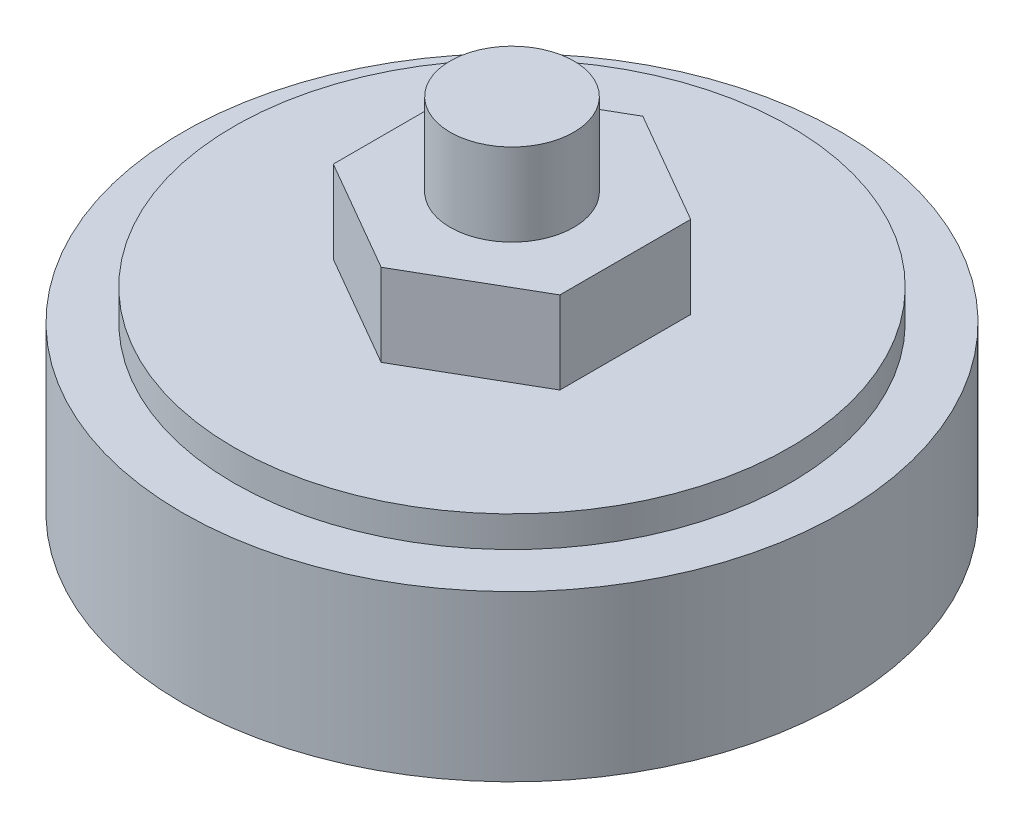
ISO-10303-21;
HEADER;
FILE_DESCRIPTION(('STEP AP214'),'2;1');
FILE_NAME('part.step','',(''),(''),'','','');
FILE_SCHEMA(('AUTOMOTIVE_DESIGN { 1 0 10303 214 1 1 1 1 }'));
ENDSEC;
DATA;
#1=APPLICATION_CONTEXT('core data for automotive mechanical design processes');
#2=APPLICATION_PROTOCOL_DEFINITION('international standard','automotive_design',2000,#1);
#3=PRODUCT_CONTEXT('',#1,'mechanical');
#4=PRODUCT('Part','Part','',(#3));
#5=PRODUCT_RELATED_PRODUCT_CATEGORY('part','',(#4));
#6=PRODUCT_DEFINITION_FORMATION('','',#4);
#7=PRODUCT_DEFINITION_CONTEXT('part definition',#1,'design');
#8=PRODUCT_DEFINITION('design','',#6,#7);
#9=PRODUCT_DEFINITION_SHAPE('','',#8);
#10=(LENGTH_UNIT() NAMED_UNIT(*) SI_UNIT(.MILLI.,.METRE.));
#11=(NAMED_UNIT(*) PLANE_ANGLE_UNIT() SI_UNIT($,.RADIAN.));
#12=(NAMED_UNIT(*) SI_UNIT($,.STERADIAN.) SOLID_ANGLE_UNIT());
#13=UNCERTAINTY_MEASURE_WITH_UNIT(LENGTH_MEASURE(1.E-05),#10,'distance_accuracy_value','');
#14=(GEOMETRIC_REPRESENTATION_CONTEXT(3) GLOBAL_UNCERTAINTY_ASSIGNED_CONTEXT((#13)) GLOBAL_UNIT_ASSIGNED_CONTEXT((#10,
#11,#12)) REPRESENTATION_CONTEXT('',''));
#15=CARTESIAN_POINT('',(0.,0.,0.));
#16=DIRECTION('',(0.,0.,1.));
#17=DIRECTION('',(1.,0.,0.));
#18=AXIS2_PLACEMENT_3D('',#15,#16,#17);
#19=CARTESIAN_POINT('',(0.,4.75,0.));
#20=DIRECTION('',(0.,1.,0.));
#21=DIRECTION('',(0.,0.,1.));
#22=AXIS2_PLACEMENT_3D('',#19,#20,#21);
#23=PLANE('',#22);
#24=DIRECTION('',(-0.866025403784439,0.,-0.5));
#25=VECTOR('',#24,1.);
#26=CARTESIAN_POINT('',(2.75,4.75,-1.58771324027147));
#27=LINE('',#26,#25);
#28=CARTESIAN_POINT('',(2.75,4.75,-1.58771324027147));
#29=VERTEX_POINT('',#28);
#30=CARTESIAN_POINT('',(0.,4.75,-3.17542648054295));
#31=VERTEX_POINT('',#30);
#32=EDGE_CURVE('E128',#29,#31,#27,.T.);
#33=ORIENTED_EDGE('',*,*,#32,.T.);
#34=DIRECTION('',(-0.866025403784438,0.,0.5));
#35=VECTOR('',#34,1.);
#36=CARTESIAN_POINT('',(0.,4.75,-3.17542648054295));
#37=LINE('',#36,#35);
#38=CARTESIAN_POINT('',(-2.75,4.75,-1.58771324027147));
#39=VERTEX_POINT('',#38);
#40=EDGE_CURVE('E83',#31,#39,#37,.T.);
#41=ORIENTED_EDGE('',*,*,#40,.T.);
#42=DIRECTION('',(0.,0.,1.));
#43=VECTOR('',#42,1.);
#44=CARTESIAN_POINT('',(-2.75,4.75,-1.58771324027147));
#45=LINE('',#44,#43);
#46=CARTESIAN_POINT('',(-2.75,4.75,1.58771324027147));
#47=VERTEX_POINT('',#46);
#48=EDGE_CURVE('E96',#39,#47,#45,.T.);
#49=ORIENTED_EDGE('',*,*,#48,.T.);
#50=DIRECTION('',(0.866025403784438,0.,0.5));
#51=VECTOR('',#50,1.);
#52=CARTESIAN_POINT('',(-2.75,4.75,1.58771324027147));
#53=LINE('',#52,#51);
#54=CARTESIAN_POINT('',(0.,4.75,3.17542648054295));
#55=VERTEX_POINT('',#54);
#56=EDGE_CURVE('E90',#47,#55,#53,.T.);
#57=ORIENTED_EDGE('',*,*,#56,.T.);
#58=DIRECTION('',(0.866025403784438,0.,-0.5));
#59=VECTOR('',#58,1.);
#60=CARTESIAN_POINT('',(0.,4.75,3.17542648054295));
#61=LINE('',#60,#59);
#62=CARTESIAN_POINT('',(2.75,4.75,1.58771324027147));
#63=VERTEX_POINT('',#62);
#64=EDGE_CURVE('E94',#55,#63,#61,.T.);
#65=ORIENTED_EDGE('',*,*,#64,.T.);
#66=DIRECTION('',(0.,0.,-1.));
#67=VECTOR('',#66,1.);
#68=CARTESIAN_POINT('',(2.75,4.75,1.58771324027147));
#69=LINE('',#68,#67);
#70=EDGE_CURVE('E55',#63,#29,#69,.T.);
#71=ORIENTED_EDGE('',*,*,#70,.T.);
#72=EDGE_LOOP('',(#33,#41,#49,#57,#65,#71));
#73=FACE_BOUND('',#72,.T.);
#74=CARTESIAN_POINT('',(0.,4.75,0.));
#75=DIRECTION('',(0.,1.,0.));
#76=DIRECTION('',(0.,0.,1.));
#77=AXIS2_PLACEMENT_3D('',#74,#75,#76);
#78=CIRCLE('',#77,1.5);
#79=CARTESIAN_POINT('',(0.,4.75,1.5));
#80=VERTEX_POINT('',#79);
#81=EDGE_CURVE('E212',#80,#80,#78,.T.);
#82=ORIENTED_EDGE('',*,*,#81,.F.);
#83=EDGE_LOOP('',(#82));
#84=FACE_BOUND('',#83,.T.);
#85=ADVANCED_FACE('F32',(#73,#84),#23,.T.);
#86=CARTESIAN_POINT('',(0.,2.75,0.));
#87=DIRECTION('',(0.,1.,0.));
#88=DIRECTION('',(0.,0.,1.));
#89=AXIS2_PLACEMENT_3D('',#86,#87,#88);
#90=PLANE('',#89);
#91=CARTESIAN_POINT('',(0.,2.75,0.));
#92=DIRECTION('',(0.,1.,0.));
#93=DIRECTION('',(0.,0.,1.));
#94=AXIS2_PLACEMENT_3D('',#91,#92,#93);
#95=CIRCLE('',#94,6.75);
#96=CARTESIAN_POINT('',(0.,2.75,6.75));
#97=VERTEX_POINT('',#96);
#98=EDGE_CURVE('E138',#97,#97,#95,.T.);
#99=ORIENTED_EDGE('',*,*,#98,.T.);
#100=EDGE_LOOP('',(#99));
#101=FACE_BOUND('',#100,.T.);
#102=DIRECTION('',(-0.866025403784438,0.,0.5));
#103=VECTOR('',#102,1.);
#104=CARTESIAN_POINT('',(0.,2.75,-3.17542648054295));
#105=LINE('',#104,#103);
#106=CARTESIAN_POINT('',(0.,2.75,-3.17542648054295));
#107=VERTEX_POINT('',#106);
#108=CARTESIAN_POINT('',(-2.75,2.75,-1.58771324027147));
#109=VERTEX_POINT('',#108);
#110=EDGE_CURVE('E119',#107,#109,#105,.T.);
#111=ORIENTED_EDGE('',*,*,#110,.F.);
#112=DIRECTION('',(-0.866025403784439,0.,-0.5));
#113=VECTOR('',#112,1.);
#114=CARTESIAN_POINT('',(2.75,2.75,-1.58771324027147));
#115=LINE('',#114,#113);
#116=CARTESIAN_POINT('',(2.75,2.75,-1.58771324027147));
#117=VERTEX_POINT('',#116);
#118=EDGE_CURVE('E116',#117,#107,#115,.T.);
#119=ORIENTED_EDGE('',*,*,#118,.F.);
#120=DIRECTION('',(0.,0.,-1.));
#121=VECTOR('',#120,1.);
#122=CARTESIAN_POINT('',(2.75,2.75,1.58771324027147));
#123=LINE('',#122,#121);
#124=CARTESIAN_POINT('',(2.75,2.75,1.58771324027147));
#125=VERTEX_POINT('',#124);
#126=EDGE_CURVE('E75',#125,#117,#123,.T.);
#127=ORIENTED_EDGE('',*,*,#126,.F.);
#128=DIRECTION('',(0.866025403784438,0.,-0.5));
#129=VECTOR('',#128,1.);
#130=CARTESIAN_POINT('',(0.,2.75,3.17542648054295));
#131=LINE('',#130,#129);
#132=CARTESIAN_POINT('',(0.,2.75,3.17542648054295));
#133=VERTEX_POINT('',#132);
#134=EDGE_CURVE('E125',#133,#125,#131,.T.);
#135=ORIENTED_EDGE('',*,*,#134,.F.);
#136=DIRECTION('',(0.866025403784438,0.,0.5));
#137=VECTOR('',#136,1.);
#138=CARTESIAN_POINT('',(-2.75,2.75,1.58771324027147));
#139=LINE('',#138,#137);
#140=CARTESIAN_POINT('',(-2.75,2.75,1.58771324027147));
#141=VERTEX_POINT('',#140);
#142=EDGE_CURVE('E105',#141,#133,#139,.T.);
#143=ORIENTED_EDGE('',*,*,#142,.F.);
#144=DIRECTION('',(0.,0.,1.));
#145=VECTOR('',#144,1.);
#146=CARTESIAN_POINT('',(-2.75,2.75,-1.58771324027147));
#147=LINE('',#146,#145);
#148=EDGE_CURVE('E122',#109,#141,#147,.T.);
#149=ORIENTED_EDGE('',*,*,#148,.F.);
#150=EDGE_LOOP('',(#111,#119,#127,#135,#143,#149));
#151=FACE_BOUND('',#150,.T.);
#152=ADVANCED_FACE('F174',(#101,#151),#90,.T.);
#153=CARTESIAN_POINT('',(0.,2.,0.));
#154=DIRECTION('',(0.,1.,0.));
#155=DIRECTION('',(0.,0.,1.));
#156=AXIS2_PLACEMENT_3D('',#153,#154,#155);
#157=PLANE('',#156);
#158=CARTESIAN_POINT('',(0.,2.,0.));
#159=DIRECTION('',(0.,1.,0.));
#160=DIRECTION('',(0.,0.,1.));
#161=AXIS2_PLACEMENT_3D('',#158,#159,#160);
#162=CIRCLE('',#161,8.);
#163=CARTESIAN_POINT('',(0.,2.,8.));
#164=VERTEX_POINT('',#163);
#165=EDGE_CURVE('E40',#164,#164,#162,.T.);
#166=ORIENTED_EDGE('',*,*,#165,.T.);
#167=EDGE_LOOP('',(#166));
#168=FACE_BOUND('',#167,.T.);
#169=CARTESIAN_POINT('',(0.,2.,0.));
#170=DIRECTION('',(0.,1.,0.));
#171=DIRECTION('',(0.,0.,1.));
#172=AXIS2_PLACEMENT_3D('',#169,#170,#171);
#173=CIRCLE('',#172,6.75);
#174=CARTESIAN_POINT('',(0.,2.,6.75));
#175=VERTEX_POINT('',#174);
#176=EDGE_CURVE('E141',#175,#175,#173,.F.);
#177=ORIENTED_EDGE('',*,*,#176,.T.);
#178=EDGE_LOOP('',(#177));
#179=FACE_BOUND('',#178,.T.);
#180=ADVANCED_FACE('F155',(#168,#179),#157,.T.);
#181=CARTESIAN_POINT('',(0.,-2.,0.));
#182=DIRECTION('',(0.,1.,0.));
#183=DIRECTION('',(0.,0.,1.));
#184=AXIS2_PLACEMENT_3D('',#181,#182,#183);
#185=PLANE('',#184);
#186=CARTESIAN_POINT('',(0.,-2.,0.));
#187=DIRECTION('',(0.,1.,0.));
#188=DIRECTION('',(0.,0.,1.));
#189=AXIS2_PLACEMENT_3D('',#186,#187,#188);
#190=CIRCLE('',#189,8.);
#191=CARTESIAN_POINT('',(0.,-2.,8.));
#192=VERTEX_POINT('',#191);
#193=EDGE_CURVE('E146',#192,#192,#190,.T.);
#194=ORIENTED_EDGE('',*,*,#193,.F.);
#195=EDGE_LOOP('',(#194));
#196=FACE_BOUND('',#195,.T.);
#197=CARTESIAN_POINT('',(0.,-2.,0.));
#198=DIRECTION('',(0.,1.,0.));
#199=DIRECTION('',(0.,0.,1.));
#200=AXIS2_PLACEMENT_3D('',#197,#198,#199);
#201=CIRCLE('',#200,6.75);
#202=CARTESIAN_POINT('',(0.,-2.,6.75));
#203=VERTEX_POINT('',#202);
#204=EDGE_CURVE('E11',#203,#203,#201,.F.);
#205=ORIENTED_EDGE('',*,*,#204,.F.);
#206=EDGE_LOOP('',(#205));
#207=FACE_BOUND('',#206,.T.);
#208=ADVANCED_FACE('F152',(#196,#207),#185,.F.);
#209=CARTESIAN_POINT('',(0.,2.,0.));
#210=DIRECTION('',(0.,-1.,0.));
#211=DIRECTION('',(0.,0.,-1.));
#212=AXIS2_PLACEMENT_3D('',#209,#210,#211);
#213=CYLINDRICAL_SURFACE('',#212,8.);
#214=ORIENTED_EDGE('',*,*,#165,.F.);
#215=EDGE_LOOP('',(#214));
#216=FACE_BOUND('',#215,.T.);
#217=ORIENTED_EDGE('',*,*,#193,.T.);
#218=EDGE_LOOP('',(#217));
#219=FACE_BOUND('',#218,.T.);
#220=ADVANCED_FACE('F34',(#216,#219),#213,.T.);
#221=CARTESIAN_POINT('',(0.,-2.75,0.));
#222=DIRECTION('',(0.,1.,0.));
#223=DIRECTION('',(0.,0.,1.));
#224=AXIS2_PLACEMENT_3D('',#221,#222,#223);
#225=PLANE('',#224);
#226=CARTESIAN_POINT('',(0.,-2.75,0.));
#227=DIRECTION('',(0.,1.,0.));
#228=DIRECTION('',(0.,0.,1.));
#229=AXIS2_PLACEMENT_3D('',#226,#227,#228);
#230=CIRCLE('',#229,6.75);
#231=CARTESIAN_POINT('',(0.,-2.75,6.75));
#232=VERTEX_POINT('',#231);
#233=EDGE_CURVE('E137',#232,#232,#230,.T.);
#234=ORIENTED_EDGE('',*,*,#233,.F.);
#235=EDGE_LOOP('',(#234));
#236=FACE_BOUND('',#235,.T.);
#237=ADVANCED_FACE('F161',(#236),#225,.F.);
#238=CARTESIAN_POINT('',(0.,2.75,0.));
#239=DIRECTION('',(0.,-1.,0.));
#240=DIRECTION('',(0.,0.,-1.));
#241=AXIS2_PLACEMENT_3D('',#238,#239,#240);
#242=CYLINDRICAL_SURFACE('',#241,6.75);
#243=ORIENTED_EDGE('',*,*,#233,.T.);
#244=EDGE_LOOP('',(#243));
#245=FACE_BOUND('',#244,.T.);
#246=ORIENTED_EDGE('',*,*,#204,.T.);
#247=EDGE_LOOP('',(#246));
#248=FACE_BOUND('',#247,.T.);
#249=ADVANCED_FACE('F158',(#245,#248),#242,.T.);
#250=ORIENTED_EDGE('',*,*,#176,.F.);
#251=EDGE_LOOP('',(#250));
#252=FACE_BOUND('',#251,.T.);
#253=ORIENTED_EDGE('',*,*,#98,.F.);
#254=EDGE_LOOP('',(#253));
#255=FACE_BOUND('',#254,.T.);
#256=ADVANCED_FACE('F160',(#252,#255),#242,.T.);
#257=CARTESIAN_POINT('',(2.75,4.75,-1.58771324027147));
#258=DIRECTION('',(-0.5,0.,0.866025403784439));
#259=DIRECTION('',(0.866025403784439,0.,0.5));
#260=AXIS2_PLACEMENT_3D('',#257,#258,#259);
#261=PLANE('',#260);
#262=ORIENTED_EDGE('',*,*,#118,.T.);
#263=DIRECTION('',(0.,-1.,0.));
#264=VECTOR('',#263,1.);
#265=CARTESIAN_POINT('',(0.,4.75,-3.17542648054295));
#266=LINE('',#265,#264);
#267=EDGE_CURVE('E135',#31,#107,#266,.T.);
#268=ORIENTED_EDGE('',*,*,#267,.F.);
#269=ORIENTED_EDGE('',*,*,#32,.F.);
#270=DIRECTION('',(0.,-1.,0.));
#271=VECTOR('',#270,1.);
#272=CARTESIAN_POINT('',(2.75,4.75,-1.58771324027147));
#273=LINE('',#272,#271);
#274=EDGE_CURVE('E112',#29,#117,#273,.T.);
#275=ORIENTED_EDGE('',*,*,#274,.T.);
#276=EDGE_LOOP('',(#262,#268,#269,#275));
#277=FACE_BOUND('',#276,.T.);
#278=ADVANCED_FACE('F168',(#277),#261,.F.);
#279=CARTESIAN_POINT('',(0.,4.75,-3.17542648054295));
#280=DIRECTION('',(0.5,0.,0.866025403784438));
#281=DIRECTION('',(0.866025403784438,0.,-0.5));
#282=AXIS2_PLACEMENT_3D('',#279,#280,#281);
#283=PLANE('',#282);
#284=ORIENTED_EDGE('',*,*,#110,.T.);
#285=DIRECTION('',(0.,-1.,0.));
#286=VECTOR('',#285,1.);
#287=CARTESIAN_POINT('',(-2.75,4.75,-1.58771324027147));
#288=LINE('',#287,#286);
#289=EDGE_CURVE('E132',#39,#109,#288,.T.);
#290=ORIENTED_EDGE('',*,*,#289,.F.);
#291=ORIENTED_EDGE('',*,*,#40,.F.);
#292=ORIENTED_EDGE('',*,*,#267,.T.);
#293=EDGE_LOOP('',(#284,#290,#291,#292));
#294=FACE_BOUND('',#293,.T.);
#295=ADVANCED_FACE('F195',(#294),#283,.F.);
#296=CARTESIAN_POINT('',(-2.75,4.75,-1.58771324027147));
#297=DIRECTION('',(1.,0.,0.));
#298=DIRECTION('',(0.,0.,-1.));
#299=AXIS2_PLACEMENT_3D('',#296,#297,#298);
#300=PLANE('',#299);
#301=ORIENTED_EDGE('',*,*,#148,.T.);
#302=DIRECTION('',(0.,-1.,0.));
#303=VECTOR('',#302,1.);
#304=CARTESIAN_POINT('',(-2.75,4.75,1.58771324027147));
#305=LINE('',#304,#303);
#306=EDGE_CURVE('E108',#47,#141,#305,.T.);
#307=ORIENTED_EDGE('',*,*,#306,.F.);
#308=ORIENTED_EDGE('',*,*,#48,.F.);
#309=ORIENTED_EDGE('',*,*,#289,.T.);
#310=EDGE_LOOP('',(#301,#307,#308,#309));
#311=FACE_BOUND('',#310,.T.);
#312=ADVANCED_FACE('F192',(#311),#300,.F.);
#313=CARTESIAN_POINT('',(-2.75,4.75,1.58771324027147));
#314=DIRECTION('',(0.5,0.,-0.866025403784438));
#315=DIRECTION('',(-0.866025403784439,0.,-0.5));
#316=AXIS2_PLACEMENT_3D('',#313,#314,#315);
#317=PLANE('',#316);
#318=ORIENTED_EDGE('',*,*,#142,.T.);
#319=DIRECTION('',(0.,-1.,0.));
#320=VECTOR('',#319,1.);
#321=CARTESIAN_POINT('',(0.,4.75,3.17542648054295));
#322=LINE('',#321,#320);
#323=EDGE_CURVE('E102',#55,#133,#322,.T.);
#324=ORIENTED_EDGE('',*,*,#323,.F.);
#325=ORIENTED_EDGE('',*,*,#56,.F.);
#326=ORIENTED_EDGE('',*,*,#306,.T.);
#327=EDGE_LOOP('',(#318,#324,#325,#326));
#328=FACE_BOUND('',#327,.T.);
#329=ADVANCED_FACE('F103',(#328),#317,.F.);
#330=CARTESIAN_POINT('',(0.,4.75,3.17542648054295));
#331=DIRECTION('',(-0.5,0.,-0.866025403784439));
#332=DIRECTION('',(-0.866025403784439,0.,0.5));
#333=AXIS2_PLACEMENT_3D('',#330,#331,#332);
#334=PLANE('',#333);
#335=ORIENTED_EDGE('',*,*,#134,.T.);
#336=DIRECTION('',(0.,-1.,0.));
#337=VECTOR('',#336,1.);
#338=CARTESIAN_POINT('',(2.75,4.75,1.58771324027147));
#339=LINE('',#338,#337);
#340=EDGE_CURVE('E47',#63,#125,#339,.T.);
#341=ORIENTED_EDGE('',*,*,#340,.F.);
#342=ORIENTED_EDGE('',*,*,#64,.F.);
#343=ORIENTED_EDGE('',*,*,#323,.T.);
#344=EDGE_LOOP('',(#335,#341,#342,#343));
#345=FACE_BOUND('',#344,.T.);
#346=ADVANCED_FACE('F110',(#345),#334,.F.);
#347=CARTESIAN_POINT('',(2.75,4.75,1.58771324027147));
#348=DIRECTION('',(-1.,0.,0.));
#349=DIRECTION('',(0.,0.,1.));
#350=AXIS2_PLACEMENT_3D('',#347,#348,#349);
#351=PLANE('',#350);
#352=ORIENTED_EDGE('',*,*,#126,.T.);
#353=ORIENTED_EDGE('',*,*,#274,.F.);
#354=ORIENTED_EDGE('',*,*,#70,.F.);
#355=ORIENTED_EDGE('',*,*,#340,.T.);
#356=EDGE_LOOP('',(#352,#353,#354,#355));
#357=FACE_BOUND('',#356,.T.);
#358=ADVANCED_FACE('F185',(#357),#351,.F.);
#359=CARTESIAN_POINT('',(0.,6.75,0.));
#360=DIRECTION('',(0.,-1.,0.));
#361=DIRECTION('',(0.,0.,-1.));
#362=AXIS2_PLACEMENT_3D('',#359,#360,#361);
#363=CYLINDRICAL_SURFACE('',#362,1.5);
#364=CARTESIAN_POINT('',(0.,6.75,0.));
#365=DIRECTION('',(0.,1.,0.));
#366=DIRECTION('',(0.,0.,1.));
#367=AXIS2_PLACEMENT_3D('',#364,#365,#366);
#368=CIRCLE('',#367,1.5);
#369=CARTESIAN_POINT('',(0.,6.75,1.5));
#370=VERTEX_POINT('',#369);
#371=EDGE_CURVE('E120',#370,#370,#368,.T.);
#372=ORIENTED_EDGE('',*,*,#371,.F.);
#373=EDGE_LOOP('',(#372));
#374=FACE_BOUND('',#373,.T.);
#375=ORIENTED_EDGE('',*,*,#81,.T.);
#376=EDGE_LOOP('',(#375));
#377=FACE_BOUND('',#376,.T.);
#378=ADVANCED_FACE('F183',(#374,#377),#363,.T.);
#379=CARTESIAN_POINT('',(0.,6.75,0.));
#380=DIRECTION('',(0.,1.,0.));
#381=DIRECTION('',(0.,0.,1.));
#382=AXIS2_PLACEMENT_3D('',#379,#380,#381);
#383=PLANE('',#382);
#384=ORIENTED_EDGE('',*,*,#371,.T.);
#385=EDGE_LOOP('',(#384));
#386=FACE_BOUND('',#385,.T.);
#387=ADVANCED_FACE('F218',(#386),#383,.T.);
#388=CLOSED_SHELL('',(#85,#152,#180,#208,#220,#237,#249,#256,#278,#295,#312,#329,#346,#358,#378,#387));
#389=MANIFOLD_SOLID_BREP('B2',#388);
#390=ADVANCED_BREP_SHAPE_REPRESENTATION('',(#18,#389),#14);
#391=SHAPE_DEFINITION_REPRESENTATION(#9,#390);
ENDSEC;
END-ISO-10303-21;
